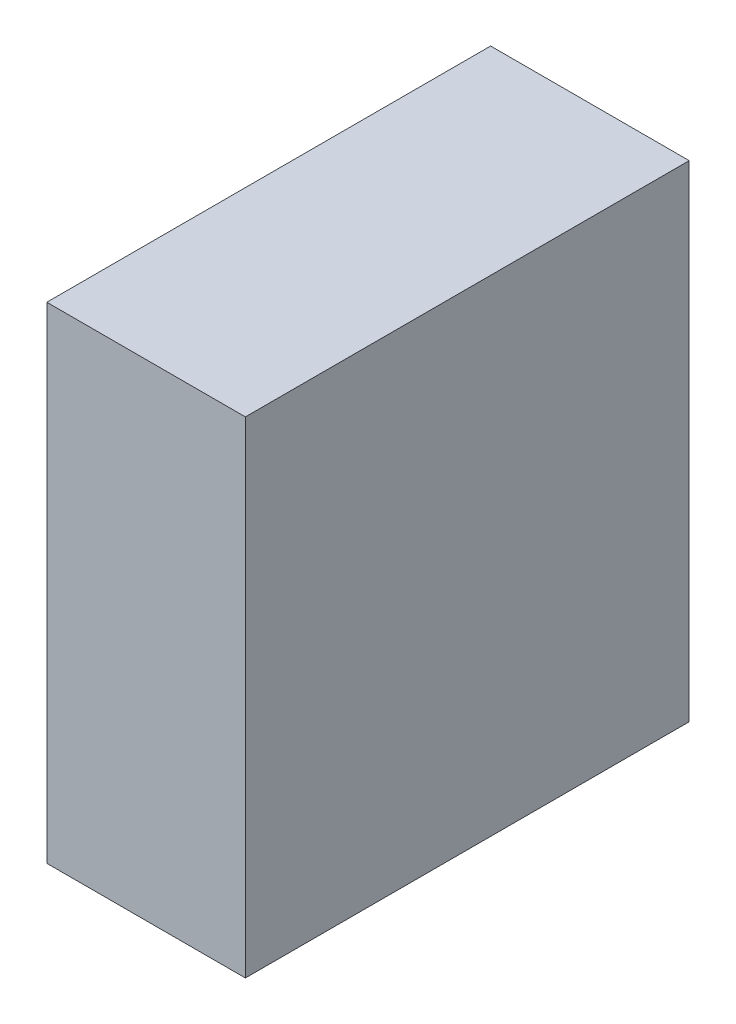
ISO-10303-21;
HEADER;
FILE_DESCRIPTION(('STEP AP214'),'2;1');
FILE_NAME('part.step','',(''),(''),'','','');
FILE_SCHEMA(('AUTOMOTIVE_DESIGN { 1 0 10303 214 1 1 1 1 }'));
ENDSEC;
DATA;
#1=APPLICATION_CONTEXT('core data for automotive mechanical design processes');
#2=APPLICATION_PROTOCOL_DEFINITION('international standard','automotive_design',2000,#1);
#3=PRODUCT_CONTEXT('',#1,'mechanical');
#4=PRODUCT('Part','Part','',(#3));
#5=PRODUCT_RELATED_PRODUCT_CATEGORY('part','',(#4));
#6=PRODUCT_DEFINITION_FORMATION('','',#4);
#7=PRODUCT_DEFINITION_CONTEXT('part definition',#1,'design');
#8=PRODUCT_DEFINITION('design','',#6,#7);
#9=PRODUCT_DEFINITION_SHAPE('','',#8);
#10=(LENGTH_UNIT() NAMED_UNIT(*) SI_UNIT(.MILLI.,.METRE.));
#11=(NAMED_UNIT(*) PLANE_ANGLE_UNIT() SI_UNIT($,.RADIAN.));
#12=(NAMED_UNIT(*) SI_UNIT($,.STERADIAN.) SOLID_ANGLE_UNIT());
#13=UNCERTAINTY_MEASURE_WITH_UNIT(LENGTH_MEASURE(1.E-05),#10,'distance_accuracy_value','');
#14=(GEOMETRIC_REPRESENTATION_CONTEXT(3) GLOBAL_UNCERTAINTY_ASSIGNED_CONTEXT((#13)) GLOBAL_UNIT_ASSIGNED_CONTEXT((#10,
#11,#12)) REPRESENTATION_CONTEXT('',''));
#15=CARTESIAN_POINT('',(0.,0.,0.));
#16=DIRECTION('',(0.,0.,1.));
#17=DIRECTION('',(1.,0.,0.));
#18=AXIS2_PLACEMENT_3D('',#15,#16,#17);
#19=CARTESIAN_POINT('',(0.,1500.,0.));
#20=DIRECTION('',(1.,0.,0.));
#21=DIRECTION('',(0.,0.,-1.));
#22=AXIS2_PLACEMENT_3D('',#19,#20,#21);
#23=PLANE('',#22);
#24=DIRECTION('',(0.,0.,1.));
#25=VECTOR('',#24,1.);
#26=CARTESIAN_POINT('',(0.,0.,0.));
#27=LINE('',#26,#25);
#28=CARTESIAN_POINT('',(0.,0.,-1370.));
#29=VERTEX_POINT('',#28);
#30=CARTESIAN_POINT('',(0.,0.,0.));
#31=VERTEX_POINT('',#30);
#32=EDGE_CURVE('E100',#29,#31,#27,.T.);
#33=ORIENTED_EDGE('',*,*,#32,.T.);
#34=DIRECTION('',(0.,-1.,0.));
#35=VECTOR('',#34,1.);
#36=CARTESIAN_POINT('',(0.,1500.,0.));
#37=LINE('',#36,#35);
#38=CARTESIAN_POINT('',(0.,1500.,0.));
#39=VERTEX_POINT('',#38);
#40=EDGE_CURVE('E11',#39,#31,#37,.T.);
#41=ORIENTED_EDGE('',*,*,#40,.F.);
#42=DIRECTION('',(0.,0.,1.));
#43=VECTOR('',#42,1.);
#44=CARTESIAN_POINT('',(0.,1500.,0.));
#45=LINE('',#44,#43);
#46=CARTESIAN_POINT('',(0.,1500.,-1370.));
#47=VERTEX_POINT('',#46);
#48=EDGE_CURVE('E88',#47,#39,#45,.T.);
#49=ORIENTED_EDGE('',*,*,#48,.F.);
#50=DIRECTION('',(0.,-1.,0.));
#51=VECTOR('',#50,1.);
#52=CARTESIAN_POINT('',(0.,1500.,-1370.));
#53=LINE('',#52,#51);
#54=EDGE_CURVE('E96',#47,#29,#53,.T.);
#55=ORIENTED_EDGE('',*,*,#54,.T.);
#56=EDGE_LOOP('',(#33,#41,#49,#55));
#57=FACE_BOUND('',#56,.T.);
#58=ADVANCED_FACE('F37',(#57),#23,.F.);
#59=CARTESIAN_POINT('',(0.,1500.,0.));
#60=DIRECTION('',(0.,0.,-1.));
#61=DIRECTION('',(-1.,0.,0.));
#62=AXIS2_PLACEMENT_3D('',#59,#60,#61);
#63=PLANE('',#62);
#64=DIRECTION('',(1.,0.,0.));
#65=VECTOR('',#64,1.);
#66=CARTESIAN_POINT('',(0.,0.,0.));
#67=LINE('',#66,#65);
#68=CARTESIAN_POINT('',(613.,0.,0.));
#69=VERTEX_POINT('',#68);
#70=EDGE_CURVE('E92',#31,#69,#67,.T.);
#71=ORIENTED_EDGE('',*,*,#70,.T.);
#72=DIRECTION('',(0.,-1.,0.));
#73=VECTOR('',#72,1.);
#74=CARTESIAN_POINT('',(613.,1500.,0.));
#75=LINE('',#74,#73);
#76=CARTESIAN_POINT('',(613.,1500.,0.));
#77=VERTEX_POINT('',#76);
#78=EDGE_CURVE('E45',#77,#69,#75,.T.);
#79=ORIENTED_EDGE('',*,*,#78,.F.);
#80=DIRECTION('',(1.,0.,0.));
#81=VECTOR('',#80,1.);
#82=CARTESIAN_POINT('',(0.,1500.,0.));
#83=LINE('',#82,#81);
#84=EDGE_CURVE('E83',#39,#77,#83,.T.);
#85=ORIENTED_EDGE('',*,*,#84,.F.);
#86=ORIENTED_EDGE('',*,*,#40,.T.);
#87=EDGE_LOOP('',(#71,#79,#85,#86));
#88=FACE_BOUND('',#87,.T.);
#89=ADVANCED_FACE('F91',(#88),#63,.F.);
#90=CARTESIAN_POINT('',(613.,1500.,0.));
#91=DIRECTION('',(-1.,0.,0.));
#92=DIRECTION('',(0.,0.,1.));
#93=AXIS2_PLACEMENT_3D('',#90,#91,#92);
#94=PLANE('',#93);
#95=DIRECTION('',(0.,0.,-1.));
#96=VECTOR('',#95,1.);
#97=CARTESIAN_POINT('',(613.,0.,0.));
#98=LINE('',#97,#96);
#99=CARTESIAN_POINT('',(613.,0.,-1370.));
#100=VERTEX_POINT('',#99);
#101=EDGE_CURVE('E70',#69,#100,#98,.T.);
#102=ORIENTED_EDGE('',*,*,#101,.T.);
#103=DIRECTION('',(0.,-1.,0.));
#104=VECTOR('',#103,1.);
#105=CARTESIAN_POINT('',(613.,1500.,-1370.));
#106=LINE('',#105,#104);
#107=CARTESIAN_POINT('',(613.,1500.,-1370.));
#108=VERTEX_POINT('',#107);
#109=EDGE_CURVE('E93',#108,#100,#106,.T.);
#110=ORIENTED_EDGE('',*,*,#109,.F.);
#111=DIRECTION('',(0.,0.,-1.));
#112=VECTOR('',#111,1.);
#113=CARTESIAN_POINT('',(613.,1500.,0.));
#114=LINE('',#113,#112);
#115=EDGE_CURVE('E86',#77,#108,#114,.T.);
#116=ORIENTED_EDGE('',*,*,#115,.F.);
#117=ORIENTED_EDGE('',*,*,#78,.T.);
#118=EDGE_LOOP('',(#102,#110,#116,#117));
#119=FACE_BOUND('',#118,.T.);
#120=ADVANCED_FACE('F94',(#119),#94,.F.);
#121=CARTESIAN_POINT('',(0.,1500.,-1370.));
#122=DIRECTION('',(0.,0.,1.));
#123=DIRECTION('',(1.,0.,0.));
#124=AXIS2_PLACEMENT_3D('',#121,#122,#123);
#125=PLANE('',#124);
#126=DIRECTION('',(-1.,0.,0.));
#127=VECTOR('',#126,1.);
#128=CARTESIAN_POINT('',(0.,0.,-1370.));
#129=LINE('',#128,#127);
#130=EDGE_CURVE('E76',#100,#29,#129,.T.);
#131=ORIENTED_EDGE('',*,*,#130,.T.);
#132=ORIENTED_EDGE('',*,*,#54,.F.);
#133=DIRECTION('',(-1.,0.,0.));
#134=VECTOR('',#133,1.);
#135=CARTESIAN_POINT('',(0.,1500.,-1370.));
#136=LINE('',#135,#134);
#137=EDGE_CURVE('E53',#108,#47,#136,.T.);
#138=ORIENTED_EDGE('',*,*,#137,.F.);
#139=ORIENTED_EDGE('',*,*,#109,.T.);
#140=EDGE_LOOP('',(#131,#132,#138,#139));
#141=FACE_BOUND('',#140,.T.);
#142=ADVANCED_FACE('F107',(#141),#125,.F.);
#143=CARTESIAN_POINT('',(0.,1500.,0.));
#144=DIRECTION('',(0.,-1.,0.));
#145=DIRECTION('',(0.,0.,-1.));
#146=AXIS2_PLACEMENT_3D('',#143,#144,#145);
#147=PLANE('',#146);
#148=ORIENTED_EDGE('',*,*,#48,.T.);
#149=ORIENTED_EDGE('',*,*,#84,.T.);
#150=ORIENTED_EDGE('',*,*,#115,.T.);
#151=ORIENTED_EDGE('',*,*,#137,.T.);
#152=EDGE_LOOP('',(#148,#149,#150,#151));
#153=FACE_BOUND('',#152,.T.);
#154=ADVANCED_FACE('F84',(#153),#147,.F.);
#155=CARTESIAN_POINT('',(0.,0.,0.));
#156=DIRECTION('',(0.,-1.,0.));
#157=DIRECTION('',(0.,0.,-1.));
#158=AXIS2_PLACEMENT_3D('',#155,#156,#157);
#159=PLANE('',#158);
#160=ORIENTED_EDGE('',*,*,#32,.F.);
#161=ORIENTED_EDGE('',*,*,#130,.F.);
#162=ORIENTED_EDGE('',*,*,#101,.F.);
#163=ORIENTED_EDGE('',*,*,#70,.F.);
#164=EDGE_LOOP('',(#160,#161,#162,#163));
#165=FACE_BOUND('',#164,.T.);
#166=ADVANCED_FACE('F110',(#165),#159,.T.);
#167=CLOSED_SHELL('',(#58,#89,#120,#142,#154,#166));
#168=MANIFOLD_SOLID_BREP('B2',#167);
#169=ADVANCED_BREP_SHAPE_REPRESENTATION('',(#18,#168),#14);
#170=SHAPE_DEFINITION_REPRESENTATION(#9,#169);
ENDSEC;
END-ISO-10303-21;
